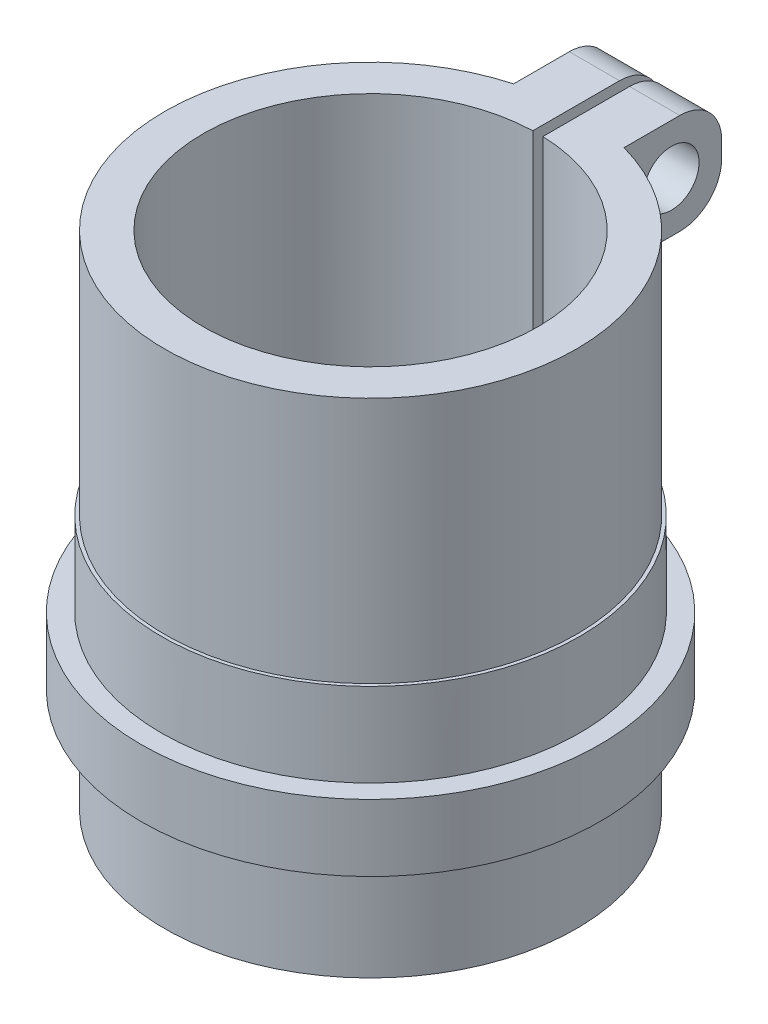
ISO-10303-21;
HEADER;
FILE_DESCRIPTION(('STEP AP214'),'2;1');
FILE_NAME('part.step','',(''),(''),'','','');
FILE_SCHEMA(('AUTOMOTIVE_DESIGN { 1 0 10303 214 1 1 1 1 }'));
ENDSEC;
DATA;
#1=APPLICATION_CONTEXT('core data for automotive mechanical design processes');
#2=APPLICATION_PROTOCOL_DEFINITION('international standard','automotive_design',2000,#1);
#3=PRODUCT_CONTEXT('',#1,'mechanical');
#4=PRODUCT('Part','Part','',(#3));
#5=PRODUCT_RELATED_PRODUCT_CATEGORY('part','',(#4));
#6=PRODUCT_DEFINITION_FORMATION('','',#4);
#7=PRODUCT_DEFINITION_CONTEXT('part definition',#1,'design');
#8=PRODUCT_DEFINITION('design','',#6,#7);
#9=PRODUCT_DEFINITION_SHAPE('','',#8);
#10=(LENGTH_UNIT() NAMED_UNIT(*) SI_UNIT(.MILLI.,.METRE.));
#11=(NAMED_UNIT(*) PLANE_ANGLE_UNIT() SI_UNIT($,.RADIAN.));
#12=(NAMED_UNIT(*) SI_UNIT($,.STERADIAN.) SOLID_ANGLE_UNIT());
#13=UNCERTAINTY_MEASURE_WITH_UNIT(LENGTH_MEASURE(1.E-05),#10,'distance_accuracy_value','');
#14=(GEOMETRIC_REPRESENTATION_CONTEXT(3) GLOBAL_UNCERTAINTY_ASSIGNED_CONTEXT((#13)) GLOBAL_UNIT_ASSIGNED_CONTEXT((#10,
#11,#12)) REPRESENTATION_CONTEXT('',''));
#15=CARTESIAN_POINT('',(0.,0.,0.));
#16=DIRECTION('',(0.,0.,1.));
#17=DIRECTION('',(1.,0.,0.));
#18=AXIS2_PLACEMENT_3D('',#15,#16,#17);
#19=CARTESIAN_POINT('',(0.,38.1,0.));
#20=DIRECTION('',(0.,1.,0.));
#21=DIRECTION('',(0.,0.,1.));
#22=AXIS2_PLACEMENT_3D('',#19,#20,#21);
#23=PLANE('',#22);
#24=DIRECTION('',(0.,0.,-1.));
#25=VECTOR('',#24,1.);
#26=CARTESIAN_POINT('',(4.191,38.1,-12.694283713546));
#27=LINE('',#26,#25);
#28=CARTESIAN_POINT('',(4.191,38.1,-15.0482942554962));
#29=VERTEX_POINT('',#28);
#30=CARTESIAN_POINT('',(4.191,38.1,-19.2768048516498));
#31=VERTEX_POINT('',#30);
#32=EDGE_CURVE('E383',#29,#31,#27,.T.);
#33=ORIENTED_EDGE('',*,*,#32,.T.);
#34=DIRECTION('',(-1.,0.,0.));
#35=VECTOR('',#34,1.);
#36=CARTESIAN_POINT('',(0.,38.1,-19.2768048516498));
#37=LINE('',#36,#35);
#38=CARTESIAN_POINT('',(0.381,38.1,-19.2768048516498));
#39=VERTEX_POINT('',#38);
#40=EDGE_CURVE('E13',#31,#39,#37,.T.);
#41=ORIENTED_EDGE('',*,*,#40,.T.);
#42=DIRECTION('',(0.,0.,-1.));
#43=VECTOR('',#42,1.);
#44=CARTESIAN_POINT('',(0.381,38.1,-12.694283713546));
#45=LINE('',#44,#43);
#46=CARTESIAN_POINT('',(0.381,38.1,-12.694283713546));
#47=VERTEX_POINT('',#46);
#48=EDGE_CURVE('E213',#47,#39,#45,.T.);
#49=ORIENTED_EDGE('',*,*,#48,.F.);
#50=CARTESIAN_POINT('',(0.,38.1,0.));
#51=DIRECTION('',(0.,1.,0.));
#52=DIRECTION('',(0.,0.,1.));
#53=AXIS2_PLACEMENT_3D('',#50,#51,#52);
#54=CIRCLE('',#53,12.7);
#55=CARTESIAN_POINT('',(-0.381,38.1,-12.694283713546));
#56=VERTEX_POINT('',#55);
#57=EDGE_CURVE('E327',#56,#47,#54,.T.);
#58=ORIENTED_EDGE('',*,*,#57,.F.);
#59=DIRECTION('',(0.,0.,1.));
#60=VECTOR('',#59,1.);
#61=CARTESIAN_POINT('',(-0.381,38.1,-12.694283713546));
#62=LINE('',#61,#60);
#63=CARTESIAN_POINT('',(-0.381,38.1,-19.2768048516498));
#64=VERTEX_POINT('',#63);
#65=EDGE_CURVE('E208',#64,#56,#62,.T.);
#66=ORIENTED_EDGE('',*,*,#65,.F.);
#67=DIRECTION('',(1.,0.,0.));
#68=VECTOR('',#67,1.);
#69=CARTESIAN_POINT('',(-4.191,38.1,-19.2768048516498));
#70=LINE('',#69,#68);
#71=CARTESIAN_POINT('',(-4.191,38.1,-19.2768048516498));
#72=VERTEX_POINT('',#71);
#73=EDGE_CURVE('E54',#64,#72,#70,.F.);
#74=ORIENTED_EDGE('',*,*,#73,.T.);
#75=DIRECTION('',(0.,0.,-1.));
#76=VECTOR('',#75,1.);
#77=CARTESIAN_POINT('',(-4.191,38.1,-12.694283713546));
#78=LINE('',#77,#76);
#79=CARTESIAN_POINT('',(-4.191,38.1,-15.0482942554962));
#80=VERTEX_POINT('',#79);
#81=EDGE_CURVE('E189',#80,#72,#78,.T.);
#82=ORIENTED_EDGE('',*,*,#81,.F.);
#83=CARTESIAN_POINT('',(0.,38.1,0.));
#84=DIRECTION('',(0.,1.,0.));
#85=DIRECTION('',(0.,0.,1.));
#86=AXIS2_PLACEMENT_3D('',#83,#84,#85);
#87=CIRCLE('',#86,15.621);
#88=EDGE_CURVE('E194',#80,#29,#87,.T.);
#89=ORIENTED_EDGE('',*,*,#88,.T.);
#90=EDGE_LOOP('',(#33,#41,#49,#58,#66,#74,#82,#89));
#91=FACE_BOUND('',#90,.T.);
#92=ADVANCED_FACE('F45',(#91),#23,.T.);
#93=CARTESIAN_POINT('',(0.,0.,0.));
#94=DIRECTION('',(0.,1.,0.));
#95=DIRECTION('',(0.,0.,1.));
#96=AXIS2_PLACEMENT_3D('',#93,#94,#95);
#97=PLANE('',#96);
#98=CARTESIAN_POINT('',(0.,0.,0.));
#99=DIRECTION('',(0.,1.,0.));
#100=DIRECTION('',(0.,0.,1.));
#101=AXIS2_PLACEMENT_3D('',#98,#99,#100);
#102=CIRCLE('',#101,12.7);
#103=CARTESIAN_POINT('',(0.,0.,12.7));
#104=VERTEX_POINT('',#103);
#105=EDGE_CURVE('E332',#104,#104,#102,.T.);
#106=ORIENTED_EDGE('',*,*,#105,.T.);
#107=EDGE_LOOP('',(#106));
#108=FACE_BOUND('',#107,.T.);
#109=CARTESIAN_POINT('',(0.,0.,0.));
#110=DIRECTION('',(0.,-1.,0.));
#111=DIRECTION('',(0.,0.,-1.));
#112=AXIS2_PLACEMENT_3D('',#109,#110,#111);
#113=CIRCLE('',#112,15.621);
#114=CARTESIAN_POINT('',(0.,0.,-15.621));
#115=VERTEX_POINT('',#114);
#116=EDGE_CURVE('E359',#115,#115,#113,.T.);
#117=ORIENTED_EDGE('',*,*,#116,.T.);
#118=EDGE_LOOP('',(#117));
#119=FACE_BOUND('',#118,.T.);
#120=ADVANCED_FACE('F439',(#108,#119),#97,.F.);
#121=CARTESIAN_POINT('',(0.,38.1,0.));
#122=DIRECTION('',(0.,-1.,0.));
#123=DIRECTION('',(0.,0.,-1.));
#124=AXIS2_PLACEMENT_3D('',#121,#122,#123);
#125=CYLINDRICAL_SURFACE('',#124,15.875);
#126=CARTESIAN_POINT('',(0.,19.05,0.));
#127=DIRECTION('',(0.,-1.,0.));
#128=DIRECTION('',(0.,0.,-1.));
#129=AXIS2_PLACEMENT_3D('',#126,#127,#128);
#130=CIRCLE('',#129,15.875);
#131=CARTESIAN_POINT('',(-0.381,19.05,-15.8704273414423));
#132=VERTEX_POINT('',#131);
#133=CARTESIAN_POINT('',(0.381,19.05,-15.8704273414423));
#134=VERTEX_POINT('',#133);
#135=EDGE_CURVE('E235',#132,#134,#130,.T.);
#136=ORIENTED_EDGE('',*,*,#135,.T.);
#137=DIRECTION('',(0.,-1.,0.));
#138=VECTOR('',#137,1.);
#139=CARTESIAN_POINT('',(0.381,38.1,-15.8704273414423));
#140=LINE('',#139,#138);
#141=CARTESIAN_POINT('',(0.381,19.3421,-15.8704273414423));
#142=VERTEX_POINT('',#141);
#143=EDGE_CURVE('E231',#134,#142,#140,.F.);
#144=ORIENTED_EDGE('',*,*,#143,.T.);
#145=CARTESIAN_POINT('',(0.,19.3421,0.));
#146=DIRECTION('',(0.,-1.,0.));
#147=DIRECTION('',(0.,0.,-1.));
#148=AXIS2_PLACEMENT_3D('',#145,#146,#147);
#149=CIRCLE('',#148,15.875);
#150=CARTESIAN_POINT('',(-0.381,19.3421,-15.8704273414423));
#151=VERTEX_POINT('',#150);
#152=EDGE_CURVE('E239',#151,#142,#149,.F.);
#153=ORIENTED_EDGE('',*,*,#152,.F.);
#154=DIRECTION('',(0.,-1.,0.));
#155=VECTOR('',#154,1.);
#156=CARTESIAN_POINT('',(-0.381,38.1,-15.8704273414423));
#157=LINE('',#156,#155);
#158=EDGE_CURVE('E223',#151,#132,#157,.T.);
#159=ORIENTED_EDGE('',*,*,#158,.T.);
#160=EDGE_LOOP('',(#136,#144,#153,#159));
#161=FACE_BOUND('',#160,.T.);
#162=CARTESIAN_POINT('',(0.,12.9921,0.));
#163=DIRECTION('',(0.,-1.,0.));
#164=DIRECTION('',(0.,0.,-1.));
#165=AXIS2_PLACEMENT_3D('',#162,#163,#164);
#166=CIRCLE('',#165,15.875);
#167=CARTESIAN_POINT('',(0.,12.9921,-15.875));
#168=VERTEX_POINT('',#167);
#169=EDGE_CURVE('E331',#168,#168,#166,.T.);
#170=ORIENTED_EDGE('',*,*,#169,.F.);
#171=EDGE_LOOP('',(#170));
#172=FACE_BOUND('',#171,.T.);
#173=ADVANCED_FACE('F313',(#161,#172),#125,.T.);
#174=CARTESIAN_POINT('',(0.,38.1,0.));
#175=DIRECTION('',(0.,-1.,0.));
#176=DIRECTION('',(0.,0.,-1.));
#177=AXIS2_PLACEMENT_3D('',#174,#175,#176);
#178=CYLINDRICAL_SURFACE('',#177,12.7);
#179=DIRECTION('',(0.,1.,0.));
#180=VECTOR('',#179,1.);
#181=CARTESIAN_POINT('',(0.381,19.05,-12.694283713546));
#182=LINE('',#181,#180);
#183=CARTESIAN_POINT('',(0.381,19.05,-12.694283713546));
#184=VERTEX_POINT('',#183);
#185=EDGE_CURVE('E224',#184,#47,#182,.T.);
#186=ORIENTED_EDGE('',*,*,#185,.F.);
#187=CARTESIAN_POINT('',(-0.381000000000003,19.05,-12.694283713546));
#188=CARTESIAN_POINT('',(0.,19.05,-12.7057188605205));
#189=CARTESIAN_POINT('',(0.381,19.05,-12.694283713546));
#190=B_SPLINE_CURVE_WITH_KNOTS('',2,(#187,#188,#189),.UNSPECIFIED.,.F.,.F.,(3,3),(0.,1.),.UNSPECIFIED.);
#191=CARTESIAN_POINT('',(-0.381,19.05,-12.694283713546));
#192=VERTEX_POINT('',#191);
#193=EDGE_CURVE('E204',#192,#184,#190,.T.);
#194=ORIENTED_EDGE('',*,*,#193,.F.);
#195=DIRECTION('',(0.,1.,0.));
#196=VECTOR('',#195,1.);
#197=CARTESIAN_POINT('',(-0.381,19.05,-12.694283713546));
#198=LINE('',#197,#196);
#199=EDGE_CURVE('E240',#192,#56,#198,.T.);
#200=ORIENTED_EDGE('',*,*,#199,.T.);
#201=ORIENTED_EDGE('',*,*,#57,.T.);
#202=EDGE_LOOP('',(#186,#194,#200,#201));
#203=FACE_BOUND('',#202,.T.);
#204=ORIENTED_EDGE('',*,*,#105,.F.);
#205=EDGE_LOOP('',(#204));
#206=FACE_BOUND('',#205,.T.);
#207=ADVANCED_FACE('F308',(#203,#206),#178,.F.);
#208=CARTESIAN_POINT('',(0.,12.9921,0.));
#209=DIRECTION('',(0.,-1.,0.));
#210=DIRECTION('',(0.,0.,-1.));
#211=AXIS2_PLACEMENT_3D('',#208,#209,#210);
#212=CYLINDRICAL_SURFACE('',#211,17.399);
#213=CARTESIAN_POINT('',(0.,12.9921,0.));
#214=DIRECTION('',(0.,-1.,0.));
#215=DIRECTION('',(0.,0.,-1.));
#216=AXIS2_PLACEMENT_3D('',#213,#214,#215);
#217=CIRCLE('',#216,17.399);
#218=CARTESIAN_POINT('',(0.,12.9921,-17.399));
#219=VERTEX_POINT('',#218);
#220=EDGE_CURVE('E347',#219,#219,#217,.T.);
#221=ORIENTED_EDGE('',*,*,#220,.T.);
#222=EDGE_LOOP('',(#221));
#223=FACE_BOUND('',#222,.T.);
#224=CARTESIAN_POINT('',(0.,7.9248,0.));
#225=DIRECTION('',(0.,-1.,0.));
#226=DIRECTION('',(0.,0.,-1.));
#227=AXIS2_PLACEMENT_3D('',#224,#225,#226);
#228=CIRCLE('',#227,17.399);
#229=CARTESIAN_POINT('',(0.,7.9248,-17.399));
#230=VERTEX_POINT('',#229);
#231=EDGE_CURVE('E348',#230,#230,#228,.T.);
#232=ORIENTED_EDGE('',*,*,#231,.F.);
#233=EDGE_LOOP('',(#232));
#234=FACE_BOUND('',#233,.T.);
#235=ADVANCED_FACE('F301',(#223,#234),#212,.T.);
#236=CARTESIAN_POINT('',(0.,12.9921,0.));
#237=DIRECTION('',(0.,-1.,0.));
#238=DIRECTION('',(0.,0.,-1.));
#239=AXIS2_PLACEMENT_3D('',#236,#237,#238);
#240=PLANE('',#239);
#241=ORIENTED_EDGE('',*,*,#169,.T.);
#242=EDGE_LOOP('',(#241));
#243=FACE_BOUND('',#242,.T.);
#244=ORIENTED_EDGE('',*,*,#220,.F.);
#245=EDGE_LOOP('',(#244));
#246=FACE_BOUND('',#245,.T.);
#247=ADVANCED_FACE('F298',(#243,#246),#240,.F.);
#248=CARTESIAN_POINT('',(0.,7.9248,0.));
#249=DIRECTION('',(0.,-1.,0.));
#250=DIRECTION('',(0.,0.,-1.));
#251=AXIS2_PLACEMENT_3D('',#248,#249,#250);
#252=PLANE('',#251);
#253=ORIENTED_EDGE('',*,*,#231,.T.);
#254=EDGE_LOOP('',(#253));
#255=FACE_BOUND('',#254,.T.);
#256=CARTESIAN_POINT('',(0.,7.9248,0.));
#257=DIRECTION('',(0.,-1.,0.));
#258=DIRECTION('',(0.,0.,-1.));
#259=AXIS2_PLACEMENT_3D('',#256,#257,#258);
#260=CIRCLE('',#259,15.621);
#261=CARTESIAN_POINT('',(0.,7.9248,-15.621));
#262=VERTEX_POINT('',#261);
#263=EDGE_CURVE('E352',#262,#262,#260,.F.);
#264=ORIENTED_EDGE('',*,*,#263,.T.);
#265=EDGE_LOOP('',(#264));
#266=FACE_BOUND('',#265,.T.);
#267=ADVANCED_FACE('F296',(#255,#266),#252,.T.);
#268=CARTESIAN_POINT('',(0.,52.8260806053458,0.));
#269=DIRECTION('',(0.,-1.,0.));
#270=DIRECTION('',(0.,0.,-1.));
#271=AXIS2_PLACEMENT_3D('',#268,#269,#270);
#272=CYLINDRICAL_SURFACE('',#271,15.621);
#273=ORIENTED_EDGE('',*,*,#263,.F.);
#274=EDGE_LOOP('',(#273));
#275=FACE_BOUND('',#274,.T.);
#276=ORIENTED_EDGE('',*,*,#116,.F.);
#277=EDGE_LOOP('',(#276));
#278=FACE_BOUND('',#277,.T.);
#279=ADVANCED_FACE('F290',(#275,#278),#272,.T.);
#280=CARTESIAN_POINT('',(0.,-31.9091806053458,0.));
#281=DIRECTION('',(0.,1.,0.));
#282=DIRECTION('',(0.,0.,1.));
#283=AXIS2_PLACEMENT_3D('',#280,#281,#282);
#284=CYLINDRICAL_SURFACE('',#283,15.621);
#285=DIRECTION('',(0.,1.,0.));
#286=VECTOR('',#285,1.);
#287=CARTESIAN_POINT('',(-4.191,-31.9091806053458,-15.0482942554962));
#288=LINE('',#287,#286);
#289=CARTESIAN_POINT('',(-4.191,30.48,-15.0482942554962));
#290=VERTEX_POINT('',#289);
#291=EDGE_CURVE('E168',#290,#80,#288,.T.);
#292=ORIENTED_EDGE('',*,*,#291,.F.);
#293=CARTESIAN_POINT('',(0.,30.48,0.));
#294=DIRECTION('',(0.,1.,0.));
#295=DIRECTION('',(0.,0.,1.));
#296=AXIS2_PLACEMENT_3D('',#293,#294,#295);
#297=CIRCLE('',#296,15.621);
#298=CARTESIAN_POINT('',(-0.381,30.48,-15.6163529673224));
#299=VERTEX_POINT('',#298);
#300=EDGE_CURVE('E180',#290,#299,#297,.F.);
#301=ORIENTED_EDGE('',*,*,#300,.T.);
#302=DIRECTION('',(0.,1.,0.));
#303=VECTOR('',#302,1.);
#304=CARTESIAN_POINT('',(-0.381,-31.9091806053458,-15.6163529673224));
#305=LINE('',#304,#303);
#306=CARTESIAN_POINT('',(-0.381,19.3421,-15.6163529673224));
#307=VERTEX_POINT('',#306);
#308=EDGE_CURVE('E220',#307,#299,#305,.T.);
#309=ORIENTED_EDGE('',*,*,#308,.F.);
#310=CARTESIAN_POINT('',(0.,19.3421,0.));
#311=DIRECTION('',(0.,-1.,0.));
#312=DIRECTION('',(0.,0.,-1.));
#313=AXIS2_PLACEMENT_3D('',#310,#311,#312);
#314=CIRCLE('',#313,15.621);
#315=CARTESIAN_POINT('',(0.381,19.3421,-15.6163529673224));
#316=VERTEX_POINT('',#315);
#317=EDGE_CURVE('E363',#307,#316,#314,.F.);
#318=ORIENTED_EDGE('',*,*,#317,.T.);
#319=DIRECTION('',(0.,1.,0.));
#320=VECTOR('',#319,1.);
#321=CARTESIAN_POINT('',(0.381,-31.9091806053458,-15.6163529673224));
#322=LINE('',#321,#320);
#323=CARTESIAN_POINT('',(0.381,30.48,-15.6163529673224));
#324=VERTEX_POINT('',#323);
#325=EDGE_CURVE('E228',#324,#316,#322,.F.);
#326=ORIENTED_EDGE('',*,*,#325,.F.);
#327=CARTESIAN_POINT('',(0.,30.48,0.));
#328=DIRECTION('',(0.,-1.,0.));
#329=DIRECTION('',(0.,0.,-1.));
#330=AXIS2_PLACEMENT_3D('',#327,#328,#329);
#331=CIRCLE('',#330,15.621);
#332=CARTESIAN_POINT('',(4.191,30.48,-15.0482942554962));
#333=VERTEX_POINT('',#332);
#334=EDGE_CURVE('E254',#333,#324,#331,.F.);
#335=ORIENTED_EDGE('',*,*,#334,.F.);
#336=DIRECTION('',(0.,1.,0.));
#337=VECTOR('',#336,1.);
#338=CARTESIAN_POINT('',(4.191,-31.9091806053458,-15.0482942554962));
#339=LINE('',#338,#337);
#340=EDGE_CURVE('E197',#29,#333,#339,.F.);
#341=ORIENTED_EDGE('',*,*,#340,.F.);
#342=ORIENTED_EDGE('',*,*,#88,.F.);
#343=EDGE_LOOP('',(#292,#301,#309,#318,#326,#335,#341,#342));
#344=FACE_BOUND('',#343,.T.);
#345=ADVANCED_FACE('F192',(#344),#284,.T.);
#346=CARTESIAN_POINT('',(0.,19.3421,0.));
#347=DIRECTION('',(0.,-1.,0.));
#348=DIRECTION('',(0.,0.,-1.));
#349=AXIS2_PLACEMENT_3D('',#346,#347,#348);
#350=PLANE('',#349);
#351=ORIENTED_EDGE('',*,*,#152,.T.);
#352=DIRECTION('',(0.,0.,1.));
#353=VECTOR('',#352,1.);
#354=CARTESIAN_POINT('',(0.381,19.3421,0.));
#355=LINE('',#354,#353);
#356=EDGE_CURVE('E333',#142,#316,#355,.T.);
#357=ORIENTED_EDGE('',*,*,#356,.T.);
#358=ORIENTED_EDGE('',*,*,#317,.F.);
#359=DIRECTION('',(0.,0.,-1.));
#360=VECTOR('',#359,1.);
#361=CARTESIAN_POINT('',(-0.381,19.3421,0.));
#362=LINE('',#361,#360);
#363=EDGE_CURVE('E337',#307,#151,#362,.T.);
#364=ORIENTED_EDGE('',*,*,#363,.T.);
#365=EDGE_LOOP('',(#351,#357,#358,#364));
#366=FACE_BOUND('',#365,.T.);
#367=ADVANCED_FACE('F277',(#366),#350,.F.);
#368=CARTESIAN_POINT('',(0.,19.05,0.));
#369=DIRECTION('',(0.,-1.,0.));
#370=DIRECTION('',(0.,0.,-1.));
#371=AXIS2_PLACEMENT_3D('',#368,#369,#370);
#372=PLANE('',#371);
#373=DIRECTION('',(0.,0.,1.));
#374=VECTOR('',#373,1.);
#375=CARTESIAN_POINT('',(-0.381,19.05,-12.694283713546));
#376=LINE('',#375,#374);
#377=EDGE_CURVE('E244',#132,#192,#376,.T.);
#378=ORIENTED_EDGE('',*,*,#377,.T.);
#379=ORIENTED_EDGE('',*,*,#193,.T.);
#380=DIRECTION('',(0.,0.,-1.));
#381=VECTOR('',#380,1.);
#382=CARTESIAN_POINT('',(0.381,19.05,-12.694283713546));
#383=LINE('',#382,#381);
#384=EDGE_CURVE('E212',#184,#134,#383,.T.);
#385=ORIENTED_EDGE('',*,*,#384,.T.);
#386=ORIENTED_EDGE('',*,*,#135,.F.);
#387=EDGE_LOOP('',(#378,#379,#385,#386));
#388=FACE_BOUND('',#387,.T.);
#389=ADVANCED_FACE('F266',(#388),#372,.F.);
#390=CARTESIAN_POINT('',(0.381,19.05,-12.694283713546));
#391=DIRECTION('',(1.,0.,0.));
#392=DIRECTION('',(0.,0.,-1.));
#393=AXIS2_PLACEMENT_3D('',#390,#391,#392);
#394=PLANE('',#393);
#395=DIRECTION('',(0.,-1.,0.));
#396=VECTOR('',#395,1.);
#397=CARTESIAN_POINT('',(0.381,38.1,-22.4518048516498));
#398=LINE('',#397,#396);
#399=CARTESIAN_POINT('',(0.381,34.925,-22.4518048516498));
#400=VERTEX_POINT('',#399);
#401=CARTESIAN_POINT('',(0.381,33.655,-22.4518048516498));
#402=VERTEX_POINT('',#401);
#403=EDGE_CURVE('E384',#400,#402,#398,.T.);
#404=ORIENTED_EDGE('',*,*,#403,.T.);
#405=CARTESIAN_POINT('',(0.381,33.655,-19.2768048516498));
#406=DIRECTION('',(1.,0.,0.));
#407=DIRECTION('',(0.,0.,-1.));
#408=AXIS2_PLACEMENT_3D('',#405,#406,#407);
#409=CIRCLE('',#408,3.175);
#410=CARTESIAN_POINT('',(0.381,30.48,-19.2768048516498));
#411=VERTEX_POINT('',#410);
#412=EDGE_CURVE('E455',#402,#411,#409,.F.);
#413=ORIENTED_EDGE('',*,*,#412,.T.);
#414=DIRECTION('',(0.,0.,1.));
#415=VECTOR('',#414,1.);
#416=CARTESIAN_POINT('',(0.381,30.48,-12.694283713546));
#417=LINE('',#416,#415);
#418=EDGE_CURVE('E380',#411,#324,#417,.T.);
#419=ORIENTED_EDGE('',*,*,#418,.T.);
#420=ORIENTED_EDGE('',*,*,#325,.T.);
#421=ORIENTED_EDGE('',*,*,#356,.F.);
#422=ORIENTED_EDGE('',*,*,#143,.F.);
#423=ORIENTED_EDGE('',*,*,#384,.F.);
#424=ORIENTED_EDGE('',*,*,#185,.T.);
#425=ORIENTED_EDGE('',*,*,#48,.T.);
#426=CARTESIAN_POINT('',(0.381,34.925,-19.2768048516498));
#427=DIRECTION('',(1.,0.,0.));
#428=DIRECTION('',(0.,0.,-1.));
#429=AXIS2_PLACEMENT_3D('',#426,#427,#428);
#430=CIRCLE('',#429,3.175);
#431=EDGE_CURVE('E451',#39,#400,#430,.F.);
#432=ORIENTED_EDGE('',*,*,#431,.T.);
#433=EDGE_LOOP('',(#404,#413,#419,#420,#421,#422,#423,#424,#425,#432));
#434=FACE_BOUND('',#433,.T.);
#435=CARTESIAN_POINT('',(0.381,34.29,-18.6418048516498));
#436=DIRECTION('',(-1.,0.,0.));
#437=DIRECTION('',(0.,0.,1.));
#438=AXIS2_PLACEMENT_3D('',#435,#436,#437);
#439=CIRCLE('',#438,2.1);
#440=CARTESIAN_POINT('',(0.381,34.29,-16.5418048516498));
#441=VERTEX_POINT('',#440);
#442=EDGE_CURVE('E188',#441,#441,#439,.T.);
#443=ORIENTED_EDGE('',*,*,#442,.F.);
#444=EDGE_LOOP('',(#443));
#445=FACE_BOUND('',#444,.T.);
#446=ADVANCED_FACE('F276',(#434,#445),#394,.F.);
#447=CARTESIAN_POINT('',(-0.381,19.05,-12.694283713546));
#448=DIRECTION('',(-1.,0.,0.));
#449=DIRECTION('',(0.,0.,1.));
#450=AXIS2_PLACEMENT_3D('',#447,#448,#449);
#451=PLANE('',#450);
#452=DIRECTION('',(0.,0.,1.));
#453=VECTOR('',#452,1.);
#454=CARTESIAN_POINT('',(-0.381,30.48,-12.694283713546));
#455=LINE('',#454,#453);
#456=CARTESIAN_POINT('',(-0.381,30.48,-19.2768048516498));
#457=VERTEX_POINT('',#456);
#458=EDGE_CURVE('E183',#457,#299,#455,.T.);
#459=ORIENTED_EDGE('',*,*,#458,.F.);
#460=CARTESIAN_POINT('',(-0.381,33.655,-19.2768048516498));
#461=DIRECTION('',(-1.,0.,0.));
#462=DIRECTION('',(0.,0.,1.));
#463=AXIS2_PLACEMENT_3D('',#460,#461,#462);
#464=CIRCLE('',#463,3.175);
#465=CARTESIAN_POINT('',(-0.381,33.655,-22.4518048516498));
#466=VERTEX_POINT('',#465);
#467=EDGE_CURVE('E515',#457,#466,#464,.F.);
#468=ORIENTED_EDGE('',*,*,#467,.T.);
#469=DIRECTION('',(0.,-1.,0.));
#470=VECTOR('',#469,1.);
#471=CARTESIAN_POINT('',(-0.381,38.1,-22.4518048516498));
#472=LINE('',#471,#470);
#473=CARTESIAN_POINT('',(-0.381,34.925,-22.4518048516498));
#474=VERTEX_POINT('',#473);
#475=EDGE_CURVE('E177',#474,#466,#472,.T.);
#476=ORIENTED_EDGE('',*,*,#475,.F.);
#477=CARTESIAN_POINT('',(-0.381,34.925,-19.2768048516498));
#478=DIRECTION('',(-1.,0.,0.));
#479=DIRECTION('',(0.,0.,1.));
#480=AXIS2_PLACEMENT_3D('',#477,#478,#479);
#481=CIRCLE('',#480,3.175);
#482=EDGE_CURVE('E201',#474,#64,#481,.F.);
#483=ORIENTED_EDGE('',*,*,#482,.T.);
#484=ORIENTED_EDGE('',*,*,#65,.T.);
#485=ORIENTED_EDGE('',*,*,#199,.F.);
#486=ORIENTED_EDGE('',*,*,#377,.F.);
#487=ORIENTED_EDGE('',*,*,#158,.F.);
#488=ORIENTED_EDGE('',*,*,#363,.F.);
#489=ORIENTED_EDGE('',*,*,#308,.T.);
#490=EDGE_LOOP('',(#459,#468,#476,#483,#484,#485,#486,#487,#488,#489));
#491=FACE_BOUND('',#490,.T.);
#492=CARTESIAN_POINT('',(-0.381,34.29,-18.6418048516498));
#493=DIRECTION('',(-1.,0.,0.));
#494=DIRECTION('',(0.,0.,1.));
#495=AXIS2_PLACEMENT_3D('',#492,#493,#494);
#496=CIRCLE('',#495,2.1);
#497=CARTESIAN_POINT('',(-0.381,34.29,-20.7418048516498));
#498=VERTEX_POINT('',#497);
#499=EDGE_CURVE('E413',#498,#498,#496,.T.);
#500=ORIENTED_EDGE('',*,*,#499,.T.);
#501=EDGE_LOOP('',(#500));
#502=FACE_BOUND('',#501,.T.);
#503=ADVANCED_FACE('F280',(#491,#502),#451,.F.);
#504=CARTESIAN_POINT('',(4.191,30.48,-12.694283713546));
#505=DIRECTION('',(0.,-1.,0.));
#506=DIRECTION('',(0.,0.,-1.));
#507=AXIS2_PLACEMENT_3D('',#504,#505,#506);
#508=PLANE('',#507);
#509=ORIENTED_EDGE('',*,*,#418,.F.);
#510=DIRECTION('',(-1.,0.,0.));
#511=VECTOR('',#510,1.);
#512=CARTESIAN_POINT('',(4.191,30.48,-19.2768048516498));
#513=LINE('',#512,#511);
#514=CARTESIAN_POINT('',(4.191,30.48,-19.2768048516498));
#515=VERTEX_POINT('',#514);
#516=EDGE_CURVE('E69',#411,#515,#513,.F.);
#517=ORIENTED_EDGE('',*,*,#516,.T.);
#518=DIRECTION('',(0.,0.,1.));
#519=VECTOR('',#518,1.);
#520=CARTESIAN_POINT('',(4.191,30.48,-12.694283713546));
#521=LINE('',#520,#519);
#522=EDGE_CURVE('E379',#515,#333,#521,.T.);
#523=ORIENTED_EDGE('',*,*,#522,.T.);
#524=ORIENTED_EDGE('',*,*,#334,.T.);
#525=EDGE_LOOP('',(#509,#517,#523,#524));
#526=FACE_BOUND('',#525,.T.);
#527=ADVANCED_FACE('F283',(#526),#508,.T.);
#528=CARTESIAN_POINT('',(4.191,38.1,-22.4518048516498));
#529=DIRECTION('',(0.,0.,-1.));
#530=DIRECTION('',(-1.,0.,0.));
#531=AXIS2_PLACEMENT_3D('',#528,#529,#530);
#532=PLANE('',#531);
#533=DIRECTION('',(0.,-1.,0.));
#534=VECTOR('',#533,1.);
#535=CARTESIAN_POINT('',(4.191,38.1,-22.4518048516498));
#536=LINE('',#535,#534);
#537=CARTESIAN_POINT('',(4.191,34.925,-22.4518048516498));
#538=VERTEX_POINT('',#537);
#539=CARTESIAN_POINT('',(4.191,33.655,-22.4518048516498));
#540=VERTEX_POINT('',#539);
#541=EDGE_CURVE('E391',#538,#540,#536,.T.);
#542=ORIENTED_EDGE('',*,*,#541,.T.);
#543=DIRECTION('',(-1.,0.,0.));
#544=VECTOR('',#543,1.);
#545=CARTESIAN_POINT('',(4.191,33.655,-22.4518048516498));
#546=LINE('',#545,#544);
#547=EDGE_CURVE('E456',#540,#402,#546,.T.);
#548=ORIENTED_EDGE('',*,*,#547,.T.);
#549=ORIENTED_EDGE('',*,*,#403,.F.);
#550=DIRECTION('',(-1.,0.,0.));
#551=VECTOR('',#550,1.);
#552=CARTESIAN_POINT('',(4.191,34.925,-22.4518048516498));
#553=LINE('',#552,#551);
#554=EDGE_CURVE('E452',#400,#538,#553,.F.);
#555=ORIENTED_EDGE('',*,*,#554,.T.);
#556=EDGE_LOOP('',(#542,#548,#549,#555));
#557=FACE_BOUND('',#556,.T.);
#558=ADVANCED_FACE('F278',(#557),#532,.T.);
#559=CARTESIAN_POINT('',(4.191,0.,0.));
#560=DIRECTION('',(1.,0.,0.));
#561=DIRECTION('',(0.,0.,-1.));
#562=AXIS2_PLACEMENT_3D('',#559,#560,#561);
#563=PLANE('',#562);
#564=CARTESIAN_POINT('',(4.191,34.29,-18.6418048516498));
#565=DIRECTION('',(-1.,0.,0.));
#566=DIRECTION('',(0.,0.,1.));
#567=AXIS2_PLACEMENT_3D('',#564,#565,#566);
#568=CIRCLE('',#567,2.1);
#569=CARTESIAN_POINT('',(4.191,34.29,-16.5418048516498));
#570=VERTEX_POINT('',#569);
#571=EDGE_CURVE('E388',#570,#570,#568,.T.);
#572=ORIENTED_EDGE('',*,*,#571,.T.);
#573=EDGE_LOOP('',(#572));
#574=FACE_BOUND('',#573,.T.);
#575=ORIENTED_EDGE('',*,*,#522,.F.);
#576=CARTESIAN_POINT('',(4.191,33.655,-19.2768048516498));
#577=DIRECTION('',(1.,0.,0.));
#578=DIRECTION('',(0.,0.,-1.));
#579=AXIS2_PLACEMENT_3D('',#576,#577,#578);
#580=CIRCLE('',#579,3.175);
#581=EDGE_CURVE('E469',#515,#540,#580,.T.);
#582=ORIENTED_EDGE('',*,*,#581,.T.);
#583=ORIENTED_EDGE('',*,*,#541,.F.);
#584=CARTESIAN_POINT('',(4.191,34.925,-19.2768048516498));
#585=DIRECTION('',(1.,0.,0.));
#586=DIRECTION('',(0.,0.,-1.));
#587=AXIS2_PLACEMENT_3D('',#584,#585,#586);
#588=CIRCLE('',#587,3.175);
#589=EDGE_CURVE('E61',#538,#31,#588,.T.);
#590=ORIENTED_EDGE('',*,*,#589,.T.);
#591=ORIENTED_EDGE('',*,*,#32,.F.);
#592=ORIENTED_EDGE('',*,*,#340,.T.);
#593=EDGE_LOOP('',(#575,#582,#583,#590,#591,#592));
#594=FACE_BOUND('',#593,.T.);
#595=ADVANCED_FACE('F434',(#574,#594),#563,.T.);
#596=CARTESIAN_POINT('',(4.191,34.29,-18.6418048516498));
#597=DIRECTION('',(-1.,0.,0.));
#598=DIRECTION('',(0.,0.,1.));
#599=AXIS2_PLACEMENT_3D('',#596,#597,#598);
#600=CYLINDRICAL_SURFACE('',#599,2.1);
#601=CARTESIAN_POINT('',(4.191,34.29,-16.5418048516498));
#602=CARTESIAN_POINT('',(4.1513125,34.29,-16.5418048516498));
#603=CARTESIAN_POINT('',(4.111625,34.29,-16.5418048516498));
#604=CARTESIAN_POINT('',(4.03225,34.29,-16.5418048516498));
#605=CARTESIAN_POINT('',(3.9925625,34.29,-16.5418048516498));
#606=CARTESIAN_POINT('',(3.9131875,34.29,-16.5418048516498));
#607=CARTESIAN_POINT('',(3.8735,34.29,-16.5418048516498));
#608=CARTESIAN_POINT('',(3.794125,34.29,-16.5418048516498));
#609=CARTESIAN_POINT('',(3.7544375,34.29,-16.5418048516498));
#610=CARTESIAN_POINT('',(3.6750625,34.29,-16.5418048516498));
#611=CARTESIAN_POINT('',(3.635375,34.29,-16.5418048516498));
#612=CARTESIAN_POINT('',(3.556,34.29,-16.5418048516498));
#613=CARTESIAN_POINT('',(3.5163125,34.29,-16.5418048516498));
#614=CARTESIAN_POINT('',(3.4369375,34.29,-16.5418048516498));
#615=CARTESIAN_POINT('',(3.39725,34.29,-16.5418048516498));
#616=CARTESIAN_POINT('',(3.317875,34.29,-16.5418048516498));
#617=CARTESIAN_POINT('',(3.2781875,34.29,-16.5418048516498));
#618=CARTESIAN_POINT('',(3.1988125,34.29,-16.5418048516498));
#619=CARTESIAN_POINT('',(3.159125,34.29,-16.5418048516498));
#620=CARTESIAN_POINT('',(3.07975,34.29,-16.5418048516498));
#621=CARTESIAN_POINT('',(3.0400625,34.29,-16.5418048516498));
#622=CARTESIAN_POINT('',(2.9606875,34.29,-16.5418048516498));
#623=CARTESIAN_POINT('',(2.921,34.29,-16.5418048516498));
#624=CARTESIAN_POINT('',(2.841625,34.29,-16.5418048516498));
#625=CARTESIAN_POINT('',(2.8019375,34.29,-16.5418048516498));
#626=CARTESIAN_POINT('',(2.7225625,34.29,-16.5418048516498));
#627=CARTESIAN_POINT('',(2.682875,34.29,-16.5418048516498));
#628=CARTESIAN_POINT('',(2.6035,34.29,-16.5418048516498));
#629=CARTESIAN_POINT('',(2.5638125,34.29,-16.5418048516498));
#630=CARTESIAN_POINT('',(2.4844375,34.29,-16.5418048516498));
#631=CARTESIAN_POINT('',(2.44475,34.29,-16.5418048516498));
#632=CARTESIAN_POINT('',(2.365375,34.29,-16.5418048516498));
#633=CARTESIAN_POINT('',(2.3256875,34.29,-16.5418048516498));
#634=CARTESIAN_POINT('',(2.2463125,34.29,-16.5418048516498));
#635=CARTESIAN_POINT('',(2.206625,34.29,-16.5418048516498));
#636=CARTESIAN_POINT('',(2.12725,34.29,-16.5418048516498));
#637=CARTESIAN_POINT('',(2.0875625,34.29,-16.5418048516498));
#638=CARTESIAN_POINT('',(2.0081875,34.29,-16.5418048516498));
#639=CARTESIAN_POINT('',(1.9685,34.29,-16.5418048516498));
#640=CARTESIAN_POINT('',(1.889125,34.29,-16.5418048516498));
#641=CARTESIAN_POINT('',(1.8494375,34.29,-16.5418048516498));
#642=CARTESIAN_POINT('',(1.7700625,34.29,-16.5418048516498));
#643=CARTESIAN_POINT('',(1.730375,34.29,-16.5418048516498));
#644=CARTESIAN_POINT('',(1.651,34.29,-16.5418048516498));
#645=CARTESIAN_POINT('',(1.6113125,34.29,-16.5418048516498));
#646=CARTESIAN_POINT('',(1.5319375,34.29,-16.5418048516498));
#647=CARTESIAN_POINT('',(1.49225,34.29,-16.5418048516498));
#648=CARTESIAN_POINT('',(1.412875,34.29,-16.5418048516498));
#649=CARTESIAN_POINT('',(1.3731875,34.29,-16.5418048516498));
#650=CARTESIAN_POINT('',(1.2938125,34.29,-16.5418048516498));
#651=CARTESIAN_POINT('',(1.254125,34.29,-16.5418048516498));
#652=CARTESIAN_POINT('',(1.17475,34.29,-16.5418048516498));
#653=CARTESIAN_POINT('',(1.1350625,34.29,-16.5418048516498));
#654=CARTESIAN_POINT('',(1.0556875,34.29,-16.5418048516498));
#655=CARTESIAN_POINT('',(1.016,34.29,-16.5418048516498));
#656=CARTESIAN_POINT('',(0.936625,34.29,-16.5418048516498));
#657=CARTESIAN_POINT('',(0.8969375,34.29,-16.5418048516498));
#658=CARTESIAN_POINT('',(0.8175625,34.29,-16.5418048516498));
#659=CARTESIAN_POINT('',(0.777875,34.29,-16.5418048516498));
#660=CARTESIAN_POINT('',(0.6985,34.29,-16.5418048516498));
#661=CARTESIAN_POINT('',(0.6588125,34.29,-16.5418048516498));
#662=CARTESIAN_POINT('',(0.5794375,34.29,-16.5418048516498));
#663=CARTESIAN_POINT('',(0.53975,34.29,-16.5418048516498));
#664=CARTESIAN_POINT('',(0.460375,34.29,-16.5418048516498));
#665=CARTESIAN_POINT('',(0.4206875,34.29,-16.5418048516498));
#666=CARTESIAN_POINT('',(0.381,34.29,-16.5418048516498));
#667=B_SPLINE_CURVE_WITH_KNOTS('',3,(#601,#602,#603,#604,#605,#606,#607,#608,#609,#610,#611,
#612,#613,#614,#615,#616,#617,#618,#619,#620,#621,#622,#623,#624,#625,#626,#627,#628,#629,#630,
#631,#632,#633,#634,#635,#636,#637,#638,#639,#640,#641,#642,#643,#644,#645,#646,#647,#648,#649,
#650,#651,#652,#653,#654,#655,#656,#657,#658,#659,#660,#661,#662,#663,#664,#665,#666),
.UNSPECIFIED.,.F.,.F.,(4,2,2,2,2,2,2,2,2,2,2,2,2,2,2,2,2,2,2,2,2,2,2,2,2,2,2,2,2,2,2,2,4),(0.,
0.1190625,0.238125,0.3571875,0.476250000000001,0.5953125,0.714375000000001,0.8334375,0.9525,
1.0715625,1.190625,1.3096875,1.42875,1.5478125,1.666875,1.7859375,1.905,2.0240625,2.143125,
2.2621875,2.38125,2.5003125,2.619375,2.7384375,2.8575,2.9765625,3.095625,3.2146875,3.33375,
3.4528125,3.571875,3.6909375,3.81),.UNSPECIFIED.);
#668=EDGE_CURVE('BSEAM425',#570,#441,#667,.T.);
#669=ORIENTED_EDGE('',*,*,#571,.F.);
#670=ORIENTED_EDGE('',*,*,#442,.T.);
#671=ORIENTED_EDGE('',*,*,#668,.T.);
#672=ORIENTED_EDGE('',*,*,#668,.F.);
#673=EDGE_LOOP('',(#669,#671,#670,#672));
#674=FACE_BOUND('',#673,.T.);
#675=ADVANCED_FACE('F425',(#674),#600,.F.);
#676=CARTESIAN_POINT('',(-4.191,0.,0.));
#677=DIRECTION('',(-1.,0.,0.));
#678=DIRECTION('',(0.,0.,-1.));
#679=AXIS2_PLACEMENT_3D('',#676,#677,#678);
#680=PLANE('',#679);
#681=DIRECTION('',(0.,-1.,0.));
#682=VECTOR('',#681,1.);
#683=CARTESIAN_POINT('',(-4.191,38.1,-22.4518048516498));
#684=LINE('',#683,#682);
#685=CARTESIAN_POINT('',(-4.191,34.925,-22.4518048516498));
#686=VERTEX_POINT('',#685);
#687=CARTESIAN_POINT('',(-4.191,33.655,-22.4518048516498));
#688=VERTEX_POINT('',#687);
#689=EDGE_CURVE('E176',#686,#688,#684,.T.);
#690=ORIENTED_EDGE('',*,*,#689,.T.);
#691=CARTESIAN_POINT('',(-4.191,33.655,-19.2768048516498));
#692=DIRECTION('',(-1.,0.,0.));
#693=DIRECTION('',(0.,0.,1.));
#694=AXIS2_PLACEMENT_3D('',#691,#692,#693);
#695=CIRCLE('',#694,3.175);
#696=CARTESIAN_POINT('',(-4.191,30.48,-19.2768048516498));
#697=VERTEX_POINT('',#696);
#698=EDGE_CURVE('E171',#688,#697,#695,.T.);
#699=ORIENTED_EDGE('',*,*,#698,.T.);
#700=DIRECTION('',(0.,0.,1.));
#701=VECTOR('',#700,1.);
#702=CARTESIAN_POINT('',(-4.191,30.48,-12.694283713546));
#703=LINE('',#702,#701);
#704=EDGE_CURVE('E161',#697,#290,#703,.T.);
#705=ORIENTED_EDGE('',*,*,#704,.T.);
#706=ORIENTED_EDGE('',*,*,#291,.T.);
#707=ORIENTED_EDGE('',*,*,#81,.T.);
#708=CARTESIAN_POINT('',(-4.191,34.925,-19.2768048516498));
#709=DIRECTION('',(-1.,0.,0.));
#710=DIRECTION('',(0.,0.,1.));
#711=AXIS2_PLACEMENT_3D('',#708,#709,#710);
#712=CIRCLE('',#711,3.175);
#713=EDGE_CURVE('E477',#72,#686,#712,.T.);
#714=ORIENTED_EDGE('',*,*,#713,.T.);
#715=EDGE_LOOP('',(#690,#699,#705,#706,#707,#714));
#716=FACE_BOUND('',#715,.T.);
#717=CARTESIAN_POINT('',(-4.191,34.29,-18.6418048516498));
#718=DIRECTION('',(-1.,0.,0.));
#719=DIRECTION('',(0.,0.,1.));
#720=AXIS2_PLACEMENT_3D('',#717,#718,#719);
#721=CIRCLE('',#720,2.1);
#722=CARTESIAN_POINT('',(-4.191,34.29,-20.7418048516498));
#723=VERTEX_POINT('',#722);
#724=EDGE_CURVE('E408',#723,#723,#721,.T.);
#725=ORIENTED_EDGE('',*,*,#724,.F.);
#726=EDGE_LOOP('',(#725));
#727=FACE_BOUND('',#726,.T.);
#728=ADVANCED_FACE('F164',(#716,#727),#680,.T.);
#729=CARTESIAN_POINT('',(-4.191,38.1,-22.4518048516498));
#730=DIRECTION('',(0.,0.,1.));
#731=DIRECTION('',(1.,0.,0.));
#732=AXIS2_PLACEMENT_3D('',#729,#730,#731);
#733=PLANE('',#732);
#734=ORIENTED_EDGE('',*,*,#475,.T.);
#735=DIRECTION('',(1.,0.,0.));
#736=VECTOR('',#735,1.);
#737=CARTESIAN_POINT('',(-4.191,33.655,-22.4518048516498));
#738=LINE('',#737,#736);
#739=EDGE_CURVE('E483',#466,#688,#738,.F.);
#740=ORIENTED_EDGE('',*,*,#739,.T.);
#741=ORIENTED_EDGE('',*,*,#689,.F.);
#742=DIRECTION('',(1.,0.,0.));
#743=VECTOR('',#742,1.);
#744=CARTESIAN_POINT('',(-0.381,34.925,-22.4518048516498));
#745=LINE('',#744,#743);
#746=EDGE_CURVE('E481',#686,#474,#745,.T.);
#747=ORIENTED_EDGE('',*,*,#746,.T.);
#748=EDGE_LOOP('',(#734,#740,#741,#747));
#749=FACE_BOUND('',#748,.T.);
#750=ADVANCED_FACE('F424',(#749),#733,.F.);
#751=CARTESIAN_POINT('',(-4.191,30.48,-12.694283713546));
#752=DIRECTION('',(0.,1.,0.));
#753=DIRECTION('',(0.,0.,1.));
#754=AXIS2_PLACEMENT_3D('',#751,#752,#753);
#755=PLANE('',#754);
#756=ORIENTED_EDGE('',*,*,#704,.F.);
#757=DIRECTION('',(1.,0.,0.));
#758=VECTOR('',#757,1.);
#759=CARTESIAN_POINT('',(-4.191,30.48,-19.2768048516498));
#760=LINE('',#759,#758);
#761=EDGE_CURVE('E196',#697,#457,#760,.T.);
#762=ORIENTED_EDGE('',*,*,#761,.T.);
#763=ORIENTED_EDGE('',*,*,#458,.T.);
#764=ORIENTED_EDGE('',*,*,#300,.F.);
#765=EDGE_LOOP('',(#756,#762,#763,#764));
#766=FACE_BOUND('',#765,.T.);
#767=ADVANCED_FACE('F181',(#766),#755,.F.);
#768=CARTESIAN_POINT('',(-4.191,34.29,-18.6418048516498));
#769=DIRECTION('',(1.,0.,0.));
#770=DIRECTION('',(0.,0.,-1.));
#771=AXIS2_PLACEMENT_3D('',#768,#769,#770);
#772=CYLINDRICAL_SURFACE('',#771,2.1);
#773=CARTESIAN_POINT('',(-4.191,34.29,-20.7418048516498));
#774=CARTESIAN_POINT('',(-4.1513125,34.29,-20.7418048516498));
#775=CARTESIAN_POINT('',(-4.111625,34.29,-20.7418048516498));
#776=CARTESIAN_POINT('',(-4.03225,34.29,-20.7418048516498));
#777=CARTESIAN_POINT('',(-3.9925625,34.29,-20.7418048516498));
#778=CARTESIAN_POINT('',(-3.9131875,34.29,-20.7418048516498));
#779=CARTESIAN_POINT('',(-3.8735,34.29,-20.7418048516498));
#780=CARTESIAN_POINT('',(-3.794125,34.29,-20.7418048516498));
#781=CARTESIAN_POINT('',(-3.7544375,34.29,-20.7418048516498));
#782=CARTESIAN_POINT('',(-3.6750625,34.29,-20.7418048516498));
#783=CARTESIAN_POINT('',(-3.635375,34.29,-20.7418048516498));
#784=CARTESIAN_POINT('',(-3.556,34.29,-20.7418048516498));
#785=CARTESIAN_POINT('',(-3.5163125,34.29,-20.7418048516498));
#786=CARTESIAN_POINT('',(-3.4369375,34.29,-20.7418048516498));
#787=CARTESIAN_POINT('',(-3.39725,34.29,-20.7418048516498));
#788=CARTESIAN_POINT('',(-3.317875,34.29,-20.7418048516498));
#789=CARTESIAN_POINT('',(-3.2781875,34.29,-20.7418048516498));
#790=CARTESIAN_POINT('',(-3.1988125,34.29,-20.7418048516498));
#791=CARTESIAN_POINT('',(-3.159125,34.29,-20.7418048516498));
#792=CARTESIAN_POINT('',(-3.07975,34.29,-20.7418048516498));
#793=CARTESIAN_POINT('',(-3.0400625,34.29,-20.7418048516498));
#794=CARTESIAN_POINT('',(-2.9606875,34.29,-20.7418048516498));
#795=CARTESIAN_POINT('',(-2.921,34.29,-20.7418048516498));
#796=CARTESIAN_POINT('',(-2.841625,34.29,-20.7418048516498));
#797=CARTESIAN_POINT('',(-2.8019375,34.29,-20.7418048516498));
#798=CARTESIAN_POINT('',(-2.7225625,34.29,-20.7418048516498));
#799=CARTESIAN_POINT('',(-2.682875,34.29,-20.7418048516498));
#800=CARTESIAN_POINT('',(-2.6035,34.29,-20.7418048516498));
#801=CARTESIAN_POINT('',(-2.5638125,34.29,-20.7418048516498));
#802=CARTESIAN_POINT('',(-2.4844375,34.29,-20.7418048516498));
#803=CARTESIAN_POINT('',(-2.44475,34.29,-20.7418048516498));
#804=CARTESIAN_POINT('',(-2.365375,34.29,-20.7418048516498));
#805=CARTESIAN_POINT('',(-2.3256875,34.29,-20.7418048516498));
#806=CARTESIAN_POINT('',(-2.2463125,34.29,-20.7418048516498));
#807=CARTESIAN_POINT('',(-2.206625,34.29,-20.7418048516498));
#808=CARTESIAN_POINT('',(-2.12725,34.29,-20.7418048516498));
#809=CARTESIAN_POINT('',(-2.0875625,34.29,-20.7418048516498));
#810=CARTESIAN_POINT('',(-2.0081875,34.29,-20.7418048516498));
#811=CARTESIAN_POINT('',(-1.9685,34.29,-20.7418048516498));
#812=CARTESIAN_POINT('',(-1.889125,34.29,-20.7418048516498));
#813=CARTESIAN_POINT('',(-1.8494375,34.29,-20.7418048516498));
#814=CARTESIAN_POINT('',(-1.7700625,34.29,-20.7418048516498));
#815=CARTESIAN_POINT('',(-1.730375,34.29,-20.7418048516498));
#816=CARTESIAN_POINT('',(-1.651,34.29,-20.7418048516498));
#817=CARTESIAN_POINT('',(-1.6113125,34.29,-20.7418048516498));
#818=CARTESIAN_POINT('',(-1.5319375,34.29,-20.7418048516498));
#819=CARTESIAN_POINT('',(-1.49225,34.29,-20.7418048516498));
#820=CARTESIAN_POINT('',(-1.412875,34.29,-20.7418048516498));
#821=CARTESIAN_POINT('',(-1.3731875,34.29,-20.7418048516498));
#822=CARTESIAN_POINT('',(-1.2938125,34.29,-20.7418048516498));
#823=CARTESIAN_POINT('',(-1.254125,34.29,-20.7418048516498));
#824=CARTESIAN_POINT('',(-1.17475,34.29,-20.7418048516498));
#825=CARTESIAN_POINT('',(-1.1350625,34.29,-20.7418048516498));
#826=CARTESIAN_POINT('',(-1.0556875,34.29,-20.7418048516498));
#827=CARTESIAN_POINT('',(-1.016,34.29,-20.7418048516498));
#828=CARTESIAN_POINT('',(-0.936625,34.29,-20.7418048516498));
#829=CARTESIAN_POINT('',(-0.8969375,34.29,-20.7418048516498));
#830=CARTESIAN_POINT('',(-0.8175625,34.29,-20.7418048516498));
#831=CARTESIAN_POINT('',(-0.777875,34.29,-20.7418048516498));
#832=CARTESIAN_POINT('',(-0.6985,34.29,-20.7418048516498));
#833=CARTESIAN_POINT('',(-0.6588125,34.29,-20.7418048516498));
#834=CARTESIAN_POINT('',(-0.5794375,34.29,-20.7418048516498));
#835=CARTESIAN_POINT('',(-0.53975,34.29,-20.7418048516498));
#836=CARTESIAN_POINT('',(-0.460375,34.29,-20.7418048516498));
#837=CARTESIAN_POINT('',(-0.4206875,34.29,-20.7418048516498));
#838=CARTESIAN_POINT('',(-0.381,34.29,-20.7418048516498));
#839=B_SPLINE_CURVE_WITH_KNOTS('',3,(#773,#774,#775,#776,#777,#778,#779,#780,#781,#782,#783,
#784,#785,#786,#787,#788,#789,#790,#791,#792,#793,#794,#795,#796,#797,#798,#799,#800,#801,#802,
#803,#804,#805,#806,#807,#808,#809,#810,#811,#812,#813,#814,#815,#816,#817,#818,#819,#820,#821,
#822,#823,#824,#825,#826,#827,#828,#829,#830,#831,#832,#833,#834,#835,#836,#837,#838),
.UNSPECIFIED.,.F.,.F.,(4,2,2,2,2,2,2,2,2,2,2,2,2,2,2,2,2,2,2,2,2,2,2,2,2,2,2,2,2,2,2,2,4),(0.,
0.1190625,0.238125,0.3571875,0.47625,0.5953125,0.714375,0.8334375,0.9525,1.0715625,1.190625,
1.3096875,1.42875,1.5478125,1.666875,1.7859375,1.905,2.0240625,2.143125,2.2621875,2.38125,
2.5003125,2.619375,2.7384375,2.8575,2.9765625,3.095625,3.2146875,3.33375,3.4528125,3.571875,
3.6909375,3.81),.UNSPECIFIED.);
#840=EDGE_CURVE('BSEAM421',#723,#498,#839,.T.);
#841=ORIENTED_EDGE('',*,*,#724,.T.);
#842=ORIENTED_EDGE('',*,*,#499,.F.);
#843=ORIENTED_EDGE('',*,*,#840,.T.);
#844=ORIENTED_EDGE('',*,*,#840,.F.);
#845=EDGE_LOOP('',(#841,#843,#842,#844));
#846=FACE_BOUND('',#845,.T.);
#847=ADVANCED_FACE('F421',(#846),#772,.F.);
#848=CARTESIAN_POINT('',(-4.191,33.655,-19.2768048516498));
#849=DIRECTION('',(1.,0.,0.));
#850=DIRECTION('',(0.,0.,-1.));
#851=AXIS2_PLACEMENT_3D('',#848,#849,#850);
#852=CYLINDRICAL_SURFACE('',#851,3.175);
#853=ORIENTED_EDGE('',*,*,#698,.F.);
#854=ORIENTED_EDGE('',*,*,#739,.F.);
#855=ORIENTED_EDGE('',*,*,#467,.F.);
#856=ORIENTED_EDGE('',*,*,#761,.F.);
#857=EDGE_LOOP('',(#853,#854,#855,#856));
#858=FACE_BOUND('',#857,.T.);
#859=ADVANCED_FACE('F520',(#858),#852,.T.);
#860=CARTESIAN_POINT('',(4.191,33.655,-19.2768048516498));
#861=DIRECTION('',(-1.,0.,0.));
#862=DIRECTION('',(0.,0.,1.));
#863=AXIS2_PLACEMENT_3D('',#860,#861,#862);
#864=CYLINDRICAL_SURFACE('',#863,3.175);
#865=ORIENTED_EDGE('',*,*,#581,.F.);
#866=ORIENTED_EDGE('',*,*,#516,.F.);
#867=ORIENTED_EDGE('',*,*,#412,.F.);
#868=ORIENTED_EDGE('',*,*,#547,.F.);
#869=EDGE_LOOP('',(#865,#866,#867,#868));
#870=FACE_BOUND('',#869,.T.);
#871=ADVANCED_FACE('F495',(#870),#864,.T.);
#872=CARTESIAN_POINT('',(0.,34.925,-19.2768048516498));
#873=DIRECTION('',(-1.,0.,0.));
#874=DIRECTION('',(0.,0.,1.));
#875=AXIS2_PLACEMENT_3D('',#872,#873,#874);
#876=CYLINDRICAL_SURFACE('',#875,3.175);
#877=ORIENTED_EDGE('',*,*,#589,.F.);
#878=ORIENTED_EDGE('',*,*,#554,.F.);
#879=ORIENTED_EDGE('',*,*,#431,.F.);
#880=ORIENTED_EDGE('',*,*,#40,.F.);
#881=EDGE_LOOP('',(#877,#878,#879,#880));
#882=FACE_BOUND('',#881,.T.);
#883=ADVANCED_FACE('F449',(#882),#876,.T.);
#884=CARTESIAN_POINT('',(-4.191,34.925,-19.2768048516498));
#885=DIRECTION('',(-1.,0.,0.));
#886=DIRECTION('',(0.,0.,1.));
#887=AXIS2_PLACEMENT_3D('',#884,#885,#886);
#888=CYLINDRICAL_SURFACE('',#887,3.175);
#889=ORIENTED_EDGE('',*,*,#713,.F.);
#890=ORIENTED_EDGE('',*,*,#73,.F.);
#891=ORIENTED_EDGE('',*,*,#482,.F.);
#892=ORIENTED_EDGE('',*,*,#746,.F.);
#893=EDGE_LOOP('',(#889,#890,#891,#892));
#894=FACE_BOUND('',#893,.T.);
#895=ADVANCED_FACE('F47',(#894),#888,.T.);
#896=CLOSED_SHELL('',(#92,#120,#173,#207,#235,#247,#267,#279,#345,#367,#389,#446,#503,#527,#558,
#595,#675,#728,#750,#767,#847,#859,#871,#883,#895));
#897=MANIFOLD_SOLID_BREP('B2',#896);
#898=ADVANCED_BREP_SHAPE_REPRESENTATION('',(#18,#897),#14);
#899=SHAPE_DEFINITION_REPRESENTATION(#9,#898);
ENDSEC;
END-ISO-10303-21;
